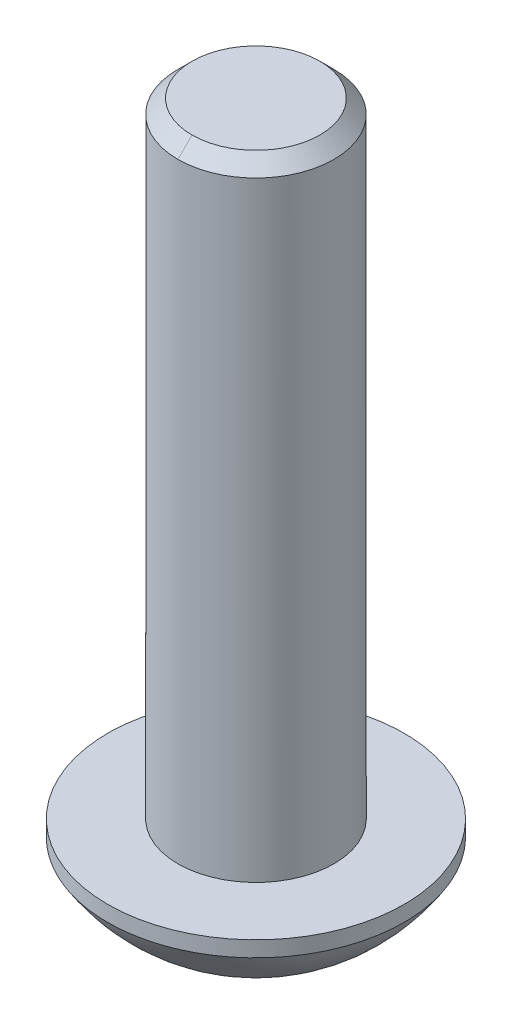
ISO-10303-21;
HEADER;
FILE_DESCRIPTION(('STEP AP214'),'2;1');
FILE_NAME('part.step','',(''),(''),'','','');
FILE_SCHEMA(('AUTOMOTIVE_DESIGN { 1 0 10303 214 1 1 1 1 }'));
ENDSEC;
DATA;
#1=APPLICATION_CONTEXT('core data for automotive mechanical design processes');
#2=APPLICATION_PROTOCOL_DEFINITION('international standard','automotive_design',2000,#1);
#3=PRODUCT_CONTEXT('',#1,'mechanical');
#4=PRODUCT('Part','Part','',(#3));
#5=PRODUCT_RELATED_PRODUCT_CATEGORY('part','',(#4));
#6=PRODUCT_DEFINITION_FORMATION('','',#4);
#7=PRODUCT_DEFINITION_CONTEXT('part definition',#1,'design');
#8=PRODUCT_DEFINITION('design','',#6,#7);
#9=PRODUCT_DEFINITION_SHAPE('','',#8);
#10=(LENGTH_UNIT() NAMED_UNIT(*) SI_UNIT(.MILLI.,.METRE.));
#11=(NAMED_UNIT(*) PLANE_ANGLE_UNIT() SI_UNIT($,.RADIAN.));
#12=(NAMED_UNIT(*) SI_UNIT($,.STERADIAN.) SOLID_ANGLE_UNIT());
#13=UNCERTAINTY_MEASURE_WITH_UNIT(LENGTH_MEASURE(1.E-05),#10,'distance_accuracy_value','');
#14=(GEOMETRIC_REPRESENTATION_CONTEXT(3) GLOBAL_UNCERTAINTY_ASSIGNED_CONTEXT((#13)) GLOBAL_UNIT_ASSIGNED_CONTEXT((#10,
#11,#12)) REPRESENTATION_CONTEXT('',''));
#15=CARTESIAN_POINT('',(0.,0.,0.));
#16=DIRECTION('',(0.,0.,1.));
#17=DIRECTION('',(1.,0.,0.));
#18=AXIS2_PLACEMENT_3D('',#15,#16,#17);
#19=CARTESIAN_POINT('',(-31.8198051533944,59.3856941615627,-26.8198051533952));
#20=DIRECTION('',(0.,-1.,0.));
#21=DIRECTION('',(1.,0.,0.));
#22=AXIS2_PLACEMENT_3D('',#19,#20,#21);
#23=CONICAL_SURFACE('',#22,1.16145793103416,1.0471975508847);
#24=CARTESIAN_POINT('',(-30.6658044417249,59.3899992192963,-26.8198032790632));
#25=CARTESIAN_POINT('',(-30.691149451724,59.404636752233,-26.8637291837364));
#26=CARTESIAN_POINT('',(-30.716713362671,59.4179474913069,-26.9080342238942));
#27=CARTESIAN_POINT('',(-30.768283692372,59.441178019231,-26.997411002029));
#28=CARTESIAN_POINT('',(-30.7942910259156,59.451089592925,-27.0424843249166));
#29=CARTESIAN_POINT('',(-30.8459830892472,59.4665135513052,-27.1320719240015));
#30=CARTESIAN_POINT('',(-30.8716598757556,59.4721287307066,-27.1765724322604));
#31=CARTESIAN_POINT('',(-30.9231338350289,59.4788239813818,-27.2657820755572));
#32=CARTESIAN_POINT('',(-30.9489308214404,59.4799096083444,-27.3104908876438));
#33=CARTESIAN_POINT('',(-30.9971512900105,59.4776115120254,-27.3940618883689));
#34=CARTESIAN_POINT('',(-31.019582001479,59.4747845594776,-27.4329366056309));
#35=CARTESIAN_POINT('',(-31.0642968874339,59.4658345557844,-27.5104320757249));
#36=CARTESIAN_POINT('',(-31.086580906583,59.4597084476974,-27.5490525593403));
#37=CARTESIAN_POINT('',(-31.131387579834,59.444398373724,-27.6267071055563));
#38=CARTESIAN_POINT('',(-31.153904549995,59.4351495456251,-27.6657313173108));
#39=CARTESIAN_POINT('',(-31.1986022933631,59.4141618012945,-27.7431970771213));
#40=CARTESIAN_POINT('',(-31.2207836410025,59.4024278214332,-27.7816396207271));
#41=CARTESIAN_POINT('',(-31.2428057752715,59.3896962755002,-27.8198062311719));
#42=B_SPLINE_CURVE_WITH_KNOTS('',3,(#24,#25,#26,#27,#28,#29,#30,#31,#32,#33,#34,#35,#36,#37,#38,
#39,#40,#41),.UNSPECIFIED.,.F.,.F.,(4,2,2,2,2,2,2,2,4),(0.,0.158413156551532,0.317206514113385,
0.472070294875533,0.626744072684247,0.761528044901939,0.896437121083261,1.03434103155732,
1.17197354407809),.UNSPECIFIED.);
#43=CARTESIAN_POINT('',(-30.6658042504201,59.3899994787229,-26.8198049557177));
#44=VERTEX_POINT('',#43);
#45=CARTESIAN_POINT('',(-31.2428044788645,59.3896961752528,-27.8198056836089));
#46=VERTEX_POINT('',#45);
#47=EDGE_CURVE('E220',#44,#46,#42,.T.);
#48=ORIENTED_EDGE('',*,*,#47,.F.);
#49=CARTESIAN_POINT('',(-31.2428058549799,59.3896962327173,-25.8198038946299));
#50=CARTESIAN_POINT('',(-31.2174521542727,59.4043583285424,-25.8637444779058));
#51=CARTESIAN_POINT('',(-31.1918796082679,59.4176952907797,-25.9080643262664));
#52=CARTESIAN_POINT('',(-31.1402912809489,59.4409804165176,-25.9974721808319));
#53=CARTESIAN_POINT('',(-31.114274580047,59.4509203364324,-26.0425617807416));
#54=CARTESIAN_POINT('',(-31.0625634019704,59.46640069337,-26.1321825378114));
#55=CARTESIAN_POINT('',(-31.0368768984193,59.4720439765283,-26.1766998757712));
#56=CARTESIAN_POINT('',(-30.9853823637518,59.4787934217649,-26.265945170391));
#57=CARTESIAN_POINT('',(-30.9595745210075,59.4799051567499,-26.3106728005841));
#58=CARTESIAN_POINT('',(-30.9113536388275,59.4776525123056,-26.3942445200003));
#59=CARTESIAN_POINT('',(-30.888933453521,59.4748487342738,-26.4331009937136));
#60=CARTESIAN_POINT('',(-30.8442387741125,59.4659462554832,-26.5105614433285));
#61=CARTESIAN_POINT('',(-30.8219644343403,59.4598445026045,-26.5491651517607));
#62=CARTESIAN_POINT('',(-30.7771769245097,59.4445833631352,-26.6267864859461));
#63=CARTESIAN_POINT('',(-30.7546694205909,59.4353591396202,-26.6657942917003));
#64=CARTESIAN_POINT('',(-30.7099900697254,59.4144193585207,-26.7432281753543));
#65=CARTESIAN_POINT('',(-30.6878176505485,59.4027087276364,-26.7816552449875));
#66=CARTESIAN_POINT('',(-30.6658043786145,59.3899995527361,-26.819806496168));
#67=B_SPLINE_CURVE_WITH_KNOTS('',3,(#49,#50,#51,#52,#53,#54,#55,#56,#57,#58,#59,#60,#61,#62,#63,
#64,#65,#66),.UNSPECIFIED.,.F.,.F.,(4,2,2,2,2,2,2,2,4),(0.,0.158482882638774,0.317347668566646,
0.472278609373679,0.627018958225682,0.761735629478716,0.896577188651897,1.03441051969929,
1.1719732475405),.UNSPECIFIED.);
#68=CARTESIAN_POINT('',(-31.242804605313,59.3896961656321,-25.8198045309822));
#69=VERTEX_POINT('',#68);
#70=EDGE_CURVE('E226',#69,#44,#67,.T.);
#71=ORIENTED_EDGE('',*,*,#70,.F.);
#72=CARTESIAN_POINT('',(-31.8198051533944,59.4789119415752,-25.8198051533952));
#73=CARTESIAN_POINT('',(-31.7953136979931,59.4789150583334,-25.8198051533952));
#74=CARTESIAN_POINT('',(-31.7708255625678,59.4783921502977,-25.8198051533952));
#75=CARTESIAN_POINT('',(-31.72189731097,59.4763217056711,-25.8198051533952));
#76=CARTESIAN_POINT('',(-31.69745718627,59.4747743714313,-25.8198051533952));
#77=CARTESIAN_POINT('',(-31.6245082186214,59.4686576453388,-25.8198051533952));
#78=CARTESIAN_POINT('',(-31.5761172803807,59.4626129454803,-25.8198051533952));
#79=CARTESIAN_POINT('',(-31.4799727656233,59.4470681907259,-25.8198051533952));
#80=CARTESIAN_POINT('',(-31.4322185407419,59.4375719820969,-25.8198051533952));
#81=CARTESIAN_POINT('',(-31.3371205700889,59.4156706472131,-25.8198051533952));
#82=CARTESIAN_POINT('',(-31.2897801365193,59.4032510056706,-25.8198051533952));
#83=CARTESIAN_POINT('',(-31.242803355853,59.3896961163618,-25.8198051533952));
#84=B_SPLINE_CURVE_WITH_KNOTS('',3,(#72,#73,#74,#75,#76,#77,#78,#79,#80,#81,#82,#83),
.UNSPECIFIED.,.F.,.F.,(4,2,2,2,2,4),(0.,0.0734625941201163,0.146910681765353,0.293048722693013,
0.439024408207726,0.585740770411544),.UNSPECIFIED.);
#85=CARTESIAN_POINT('',(-31.8198051533944,59.4789119415289,-25.8198051533924));
#86=VERTEX_POINT('',#85);
#87=EDGE_CURVE('E156',#86,#69,#84,.T.);
#88=ORIENTED_EDGE('',*,*,#87,.F.);
#89=DIRECTION('',(0.,0.499999999999999,-0.86602540378444));
#90=VECTOR('',#89,1.);
#91=CARTESIAN_POINT('',(-31.8198051533333,-288022.243641687,498946.360389693));
#92=LINE('',#91,#90);
#93=CARTESIAN_POINT('',(-31.8198051533944,60.0562622107645,-26.8198051531954));
#94=VERTEX_POINT('',#93);
#95=EDGE_CURVE('E251',#86,#94,#92,.T.);
#96=ORIENTED_EDGE('',*,*,#95,.T.);
#97=DIRECTION('',(0.,0.499999999999999,0.86602540378444));
#98=VECTOR('',#97,1.);
#99=CARTESIAN_POINT('',(-31.8198051533944,-288022.243641687,-499000.));
#100=LINE('',#99,#98);
#101=CARTESIAN_POINT('',(-31.8198051533944,59.4789119414912,-27.8198051533972));
#102=VERTEX_POINT('',#101);
#103=EDGE_CURVE('E104',#94,#102,#100,.F.);
#104=ORIENTED_EDGE('',*,*,#103,.T.);
#105=CARTESIAN_POINT('',(-31.2428032107386,59.389696005902,-27.8198050486209));
#106=CARTESIAN_POINT('',(-31.2897799942899,59.4032509429259,-27.8198051159099));
#107=CARTESIAN_POINT('',(-31.3371204372594,59.4156706076019,-27.819805143387));
#108=CARTESIAN_POINT('',(-31.432218431911,59.4375719660062,-27.8198051633528));
#109=CARTESIAN_POINT('',(-31.4799726713511,59.4470681751784,-27.8198051560174));
#110=CARTESIAN_POINT('',(-31.5761172131529,59.4626129349105,-27.81980515077));
#111=CARTESIAN_POINT('',(-31.6245081638656,59.4686576392826,-27.8198051528685));
#112=CARTESIAN_POINT('',(-31.6974571511829,59.4747743692271,-27.8198051536599));
#113=CARTESIAN_POINT('',(-31.7218972827993,59.476321704263,-27.8198051535276));
#114=CARTESIAN_POINT('',(-31.7708255484181,59.4783921499162,-27.8198051532628));
#115=CARTESIAN_POINT('',(-31.7953136909483,59.4789150581758,-27.8198051531304));
#116=CARTESIAN_POINT('',(-31.8198051533944,59.4789119415752,-27.8198051533952));
#117=B_SPLINE_CURVE_WITH_KNOTS('',3,(#105,#106,#107,#108,#109,#110,#111,#112,#113,#114,#115,
#116),.UNSPECIFIED.,.F.,.F.,(4,2,2,2,2,4),(0.,0.146716406914121,0.292692134724955,
0.438830214856948,0.512278323297038,0.585740938667434),.UNSPECIFIED.);
#118=EDGE_CURVE('E117',#46,#102,#117,.T.);
#119=ORIENTED_EDGE('',*,*,#118,.F.);
#120=EDGE_LOOP('',(#48,#71,#88,#96,#104,#119));
#121=FACE_BOUND('',#120,.T.);
#122=ADVANCED_FACE('F17',(#121),#23,.F.);
#123=CARTESIAN_POINT('',(-31.8198051533944,59.3856941615627,-26.8198051533952));
#124=DIRECTION('',(0.,-1.,0.));
#125=DIRECTION('',(1.,0.,0.));
#126=AXIS2_PLACEMENT_3D('',#123,#124,#125);
#127=CONICAL_SURFACE('',#126,1.16145793097557,1.04719755107828);
#128=CARTESIAN_POINT('',(-32.9738060540563,59.3899994146977,-26.8198068275311));
#129=CARTESIAN_POINT('',(-32.9484608928026,59.4046368374997,-26.7758809989174));
#130=CARTESIAN_POINT('',(-32.9228969249226,59.4179475277851,-26.7315759988291));
#131=CARTESIAN_POINT('',(-32.8713265638092,59.4411780140276,-26.6421992679752));
#132=CARTESIAN_POINT('',(-32.8453192559743,59.4510895948529,-26.597125952202));
#133=CARTESIAN_POINT('',(-32.7936272199141,59.4665135558323,-26.5075383737536));
#134=CARTESIAN_POINT('',(-32.7679504354991,59.4721287307787,-26.4630378787652));
#135=CARTESIAN_POINT('',(-32.7164764866102,59.4788239786491,-26.3738282604709));
#136=CARTESIAN_POINT('',(-32.6906795084846,59.4799096073155,-26.3291194601224));
#137=CARTESIAN_POINT('',(-32.6424590448288,59.4776115150825,-26.2455484662708));
#138=CARTESIAN_POINT('',(-32.6200283302202,59.4747845633488,-26.2066737441255));
#139=CARTESIAN_POINT('',(-32.5753134381117,59.4658345605116,-26.1291782637796));
#140=CARTESIAN_POINT('',(-32.5530294159511,59.4597084524343,-26.090557774798));
#141=CARTESIAN_POINT('',(-32.5082227373827,59.4443983778172,-26.012903219246));
#142=CARTESIAN_POINT('',(-32.485705764906,59.4351495491504,-25.9738790035086));
#143=CARTESIAN_POINT('',(-32.4410080172695,59.4141618032804,-25.8964132363612));
#144=CARTESIAN_POINT('',(-32.4188266676734,59.4024278224824,-25.8579706893943));
#145=CARTESIAN_POINT('',(-32.396804531521,59.3896962754668,-25.8198040756251));
#146=B_SPLINE_CURVE_WITH_KNOTS('',3,(#128,#129,#130,#131,#132,#133,#134,#135,#136,#137,#138,
#139,#140,#141,#142,#143,#144,#145),.UNSPECIFIED.,.F.,.F.,(4,2,2,2,2,2,2,2,4),(0.,
0.158413101975472,0.317206409880799,0.47207015063366,0.626743886391308,0.761527875588831,
0.896436970054835,1.03434089437143,1.17197341884806),.UNSPECIFIED.);
#147=CARTESIAN_POINT('',(-32.9738060563636,59.3899994786901,-26.8198052428653));
#148=VERTEX_POINT('',#147);
#149=CARTESIAN_POINT('',(-32.396805827921,59.38969617522,-25.8198046231851));
#150=VERTEX_POINT('',#149);
#151=EDGE_CURVE('E100',#148,#150,#146,.T.);
#152=ORIENTED_EDGE('',*,*,#151,.F.);
#153=CARTESIAN_POINT('',(-32.3968046042347,59.3896963337859,-27.8198063165473));
#154=CARTESIAN_POINT('',(-32.4221582586571,59.4043583912786,-27.7758657054694));
#155=CARTESIAN_POINT('',(-32.4477307833942,59.4176953345779,-27.7315458496549));
#156=CARTESIAN_POINT('',(-32.4993190903349,59.4409804400297,-27.6421379979177));
#157=CARTESIAN_POINT('',(-32.5253357921823,59.4509203586078,-27.5970484083279));
#158=CARTESIAN_POINT('',(-32.5770469664675,59.4664007091793,-27.5074276663338));
#159=CARTESIAN_POINT('',(-32.6027334654397,59.4720439873275,-27.46291033323));
#160=CARTESIAN_POINT('',(-32.6542279922181,59.4787934247546,-27.3736650500455));
#161=CARTESIAN_POINT('',(-32.6800358316499,59.4799051569549,-27.3289374264309));
#162=CARTESIAN_POINT('',(-32.7282567135284,59.4776525079866,-27.2453657080616));
#163=CARTESIAN_POINT('',(-32.7506769018972,59.4748487270884,-27.2065092288626));
#164=CARTESIAN_POINT('',(-32.7953715874627,59.4659462419229,-27.1290487684455));
#165=CARTESIAN_POINT('',(-32.817645930329,59.4598444855242,-27.0904450546979));
#166=CARTESIAN_POINT('',(-32.8624334460695,59.4445833385646,-27.0128237103084));
#167=CARTESIAN_POINT('',(-32.884940952803,59.4353591110957,-26.9738158996661));
#168=CARTESIAN_POINT('',(-32.9296203090817,59.4144193219781,-26.8963820066112));
#169=CARTESIAN_POINT('',(-32.9517927308588,59.4027086870428,-26.8579549324621));
#170=CARTESIAN_POINT('',(-32.9738060053741,59.3899995081289,-26.8198036768271));
#171=B_SPLINE_CURVE_WITH_KNOTS('',3,(#153,#154,#155,#156,#157,#158,#159,#160,#161,#162,#163,
#164,#165,#166,#167,#168,#169,#170),.UNSPECIFIED.,.F.,.F.,(4,2,2,2,2,2,2,2,4),(0.,
0.158482856318898,0.317347617282658,0.472278536709071,0.627018863601674,0.761735554096406,
0.896577132974556,1.03441048297191,1.17197322901768),.UNSPECIFIED.);
#172=CARTESIAN_POINT('',(-32.3968062347606,59.3896960493398,-27.8198057005802));
#173=VERTEX_POINT('',#172);
#174=EDGE_CURVE('E21',#173,#148,#171,.T.);
#175=ORIENTED_EDGE('',*,*,#174,.F.);
#176=CARTESIAN_POINT('',(-31.8198051533944,59.4789119414997,-27.8198051533952));
#177=CARTESIAN_POINT('',(-31.8442966171628,59.4789150582622,-27.8198051533952));
#178=CARTESIAN_POINT('',(-31.8687847609516,59.4783921498671,-27.8198051533952));
#179=CARTESIAN_POINT('',(-31.9177130292247,59.4763217038319,-27.8198051533952));
#180=CARTESIAN_POINT('',(-31.9421531622365,59.4747743685433,-27.8198051533952));
#181=CARTESIAN_POINT('',(-32.015102154498,59.4686576383493,-27.8198051533952));
#182=CARTESIAN_POINT('',(-32.0634931089221,59.4626129344821,-27.8198051533952));
#183=CARTESIAN_POINT('',(-32.1596376554525,59.4470681697707,-27.8198051533952));
#184=CARTESIAN_POINT('',(-32.2073918959247,59.4375719551996,-27.8198051533952));
#185=CARTESIAN_POINT('',(-32.3024898974707,59.4156706070518,-27.8198051533952));
#186=CARTESIAN_POINT('',(-32.3498303463383,59.4032509581738,-27.8198051533952));
#187=CARTESIAN_POINT('',(-32.396807142076,59.3896960611738,-27.8198051533952));
#188=B_SPLINE_CURVE_WITH_KNOTS('',3,(#176,#177,#178,#179,#180,#181,#182,#183,#184,#185,#186,
#187),.UNSPECIFIED.,.F.,.F.,(4,2,2,2,2,4),(0.,0.0734626192092203,0.146910731919221,
0.293048822365536,0.439024557172266,0.585740969270727),.UNSPECIFIED.);
#189=EDGE_CURVE('E97',#102,#173,#188,.T.);
#190=ORIENTED_EDGE('',*,*,#189,.F.);
#191=ORIENTED_EDGE('',*,*,#103,.F.);
#192=ORIENTED_EDGE('',*,*,#95,.F.);
#193=CARTESIAN_POINT('',(-32.3968070960403,59.3896960058726,-25.8198052581644));
#194=CARTESIAN_POINT('',(-32.3498303124883,59.4032509428883,-25.8198051908787));
#195=CARTESIAN_POINT('',(-32.3024898695189,59.4156706075577,-25.8198051634029));
#196=CARTESIAN_POINT('',(-32.2073918748681,59.4375719659509,-25.819805143438));
#197=CARTESIAN_POINT('',(-32.1596376354286,59.4470681751187,-25.8198051507731));
#198=CARTESIAN_POINT('',(-32.0634930936285,59.4626129348433,-25.8198051560202));
#199=CARTESIAN_POINT('',(-32.0151021429169,59.4686576392123,-25.8198051539218));
#200=CARTESIAN_POINT('',(-31.9421531556016,59.4747743691537,-25.8198051531305));
#201=CARTESIAN_POINT('',(-31.9177130239861,59.4763217041888,-25.8198051532628));
#202=CARTESIAN_POINT('',(-31.8687847583689,59.4783921498409,-25.8198051535276));
#203=CARTESIAN_POINT('',(-31.8442966158397,59.4789150581003,-25.81980515366));
#204=CARTESIAN_POINT('',(-31.8198051533944,59.4789119414997,-25.8198051533952));
#205=B_SPLINE_CURVE_WITH_KNOTS('',3,(#193,#194,#195,#196,#197,#198,#199,#200,#201,#202,#203,
#204),.UNSPECIFIED.,.F.,.F.,(4,2,2,2,2,4),(0.,0.146716406909033,0.292692134715531,
0.438830214843196,0.512278323280733,0.585740938648524),.UNSPECIFIED.);
#206=EDGE_CURVE('E149',#150,#86,#205,.T.);
#207=ORIENTED_EDGE('',*,*,#206,.F.);
#208=EDGE_LOOP('',(#152,#175,#190,#191,#192,#207));
#209=FACE_BOUND('',#208,.T.);
#210=ADVANCED_FACE('F94',(#209),#127,.F.);
#211=CARTESIAN_POINT('',(-32.983185324538,60.1416573160268,-26.8035483576523));
#212=DIRECTION('',(0.866156744758905,0.,0.499772441725889));
#213=DIRECTION('',(0.499772441725889,0.,-0.866156744758905));
#214=AXIS2_PLACEMENT_3D('',#211,#212,#213);
#215=PLANE('',#214);
#216=ORIENTED_EDGE('',*,*,#174,.T.);
#217=DIRECTION('',(0.,1.,0.));
#218=VECTOR('',#217,1.);
#219=CARTESIAN_POINT('',(-32.9738051533943,60.1416573160268,-26.8198051533952));
#220=LINE('',#219,#218);
#221=CARTESIAN_POINT('',(-32.9738052620286,58.3500000000004,-26.8198045878865));
#222=VERTEX_POINT('',#221);
#223=EDGE_CURVE('E103',#222,#148,#220,.T.);
#224=ORIENTED_EDGE('',*,*,#223,.F.);
#225=DIRECTION('',(-0.499772441725893,0.,0.866156744758902));
#226=VECTOR('',#225,1.);
#227=CARTESIAN_POINT('',(-32.3968051533943,58.3500000000004,-27.8198051533952));
#228=LINE('',#227,#226);
#229=CARTESIAN_POINT('',(-32.3968079475784,58.3500000000004,-27.8198051533952));
#230=VERTEX_POINT('',#229);
#231=EDGE_CURVE('E109',#230,#222,#228,.T.);
#232=ORIENTED_EDGE('',*,*,#231,.F.);
#233=DIRECTION('',(0.,1.,0.));
#234=VECTOR('',#233,1.);
#235=CARTESIAN_POINT('',(-32.3968079475784,60.1416573160268,-27.8198051533952));
#236=LINE('',#235,#234);
#237=EDGE_CURVE('E106',#173,#230,#236,.F.);
#238=ORIENTED_EDGE('',*,*,#237,.F.);
#239=EDGE_LOOP('',(#216,#224,#232,#238));
#240=FACE_BOUND('',#239,.T.);
#241=ADVANCED_FACE('F107',(#240),#215,.T.);
#242=CARTESIAN_POINT('',(-32.3874249822507,60.1416573160268,-25.8035483576523));
#243=DIRECTION('',(0.866156744758906,0.,-0.499772441725888));
#244=DIRECTION('',(-0.499772441725888,0.,-0.866156744758906));
#245=AXIS2_PLACEMENT_3D('',#242,#243,#244);
#246=PLANE('',#245);
#247=ORIENTED_EDGE('',*,*,#151,.T.);
#248=DIRECTION('',(0.,1.,0.));
#249=VECTOR('',#248,1.);
#250=CARTESIAN_POINT('',(-32.3968051533943,60.1416573160268,-25.8198051533952));
#251=LINE('',#250,#249);
#252=CARTESIAN_POINT('',(-32.396804913593,58.3500000000004,-25.8198051533952));
#253=VERTEX_POINT('',#252);
#254=EDGE_CURVE('E157',#253,#150,#251,.T.);
#255=ORIENTED_EDGE('',*,*,#254,.F.);
#256=DIRECTION('',(0.499772441725893,0.,0.866156744758902));
#257=VECTOR('',#256,1.);
#258=CARTESIAN_POINT('',(-32.9738051533943,58.3500000000004,-26.8198051533952));
#259=LINE('',#258,#257);
#260=EDGE_CURVE('E242',#222,#253,#259,.T.);
#261=ORIENTED_EDGE('',*,*,#260,.F.);
#262=ORIENTED_EDGE('',*,*,#223,.T.);
#263=EDGE_LOOP('',(#247,#255,#261,#262));
#264=FACE_BOUND('',#263,.T.);
#265=ADVANCED_FACE('F167',(#264),#246,.T.);
#266=CARTESIAN_POINT('',(-31.2240362690773,60.1416573160268,-25.8198051533952));
#267=DIRECTION('',(0.,0.,-1.));
#268=DIRECTION('',(-1.,0.,0.));
#269=AXIS2_PLACEMENT_3D('',#266,#267,#268);
#270=PLANE('',#269);
#271=ORIENTED_EDGE('',*,*,#87,.T.);
#272=DIRECTION('',(0.,1.,0.));
#273=VECTOR('',#272,1.);
#274=CARTESIAN_POINT('',(-31.2428051533944,60.1416573160268,-25.8198051533952));
#275=LINE('',#274,#273);
#276=CARTESIAN_POINT('',(-31.2428049789168,58.3500000000004,-25.8198054557827));
#277=VERTEX_POINT('',#276);
#278=EDGE_CURVE('E229',#277,#69,#275,.T.);
#279=ORIENTED_EDGE('',*,*,#278,.F.);
#280=DIRECTION('',(1.,0.,0.));
#281=VECTOR('',#280,1.);
#282=CARTESIAN_POINT('',(-30.5250171533944,58.3500000000004,-25.8198051533952));
#283=LINE('',#282,#281);
#284=EDGE_CURVE('E261',#253,#277,#283,.T.);
#285=ORIENTED_EDGE('',*,*,#284,.F.);
#286=ORIENTED_EDGE('',*,*,#254,.T.);
#287=ORIENTED_EDGE('',*,*,#206,.T.);
#288=EDGE_LOOP('',(#271,#279,#285,#286,#287));
#289=FACE_BOUND('',#288,.T.);
#290=ADVANCED_FACE('F162',(#289),#270,.T.);
#291=CARTESIAN_POINT('',(-30.6564249822508,60.1416573160268,-26.836061949138));
#292=DIRECTION('',(-0.866156744758905,0.,-0.499772441725888));
#293=DIRECTION('',(-0.499772441725888,0.,0.866156744758905));
#294=AXIS2_PLACEMENT_3D('',#291,#292,#293);
#295=PLANE('',#294);
#296=ORIENTED_EDGE('',*,*,#70,.T.);
#297=DIRECTION('',(0.,1.,0.));
#298=VECTOR('',#297,1.);
#299=CARTESIAN_POINT('',(-30.6658051533944,60.1416573160268,-26.8198051533952));
#300=LINE('',#299,#298);
#301=CARTESIAN_POINT('',(-30.6658053166426,58.3500000000004,-26.8198054363211));
#302=VERTEX_POINT('',#301);
#303=EDGE_CURVE('E223',#302,#44,#300,.T.);
#304=ORIENTED_EDGE('',*,*,#303,.F.);
#305=DIRECTION('',(0.499772441725889,0.,-0.866156744758905));
#306=VECTOR('',#305,1.);
#307=CARTESIAN_POINT('',(-31.2428051533944,58.3500000000004,-25.8198051533952));
#308=LINE('',#307,#306);
#309=EDGE_CURVE('E256',#277,#302,#308,.T.);
#310=ORIENTED_EDGE('',*,*,#309,.F.);
#311=ORIENTED_EDGE('',*,*,#278,.T.);
#312=EDGE_LOOP('',(#296,#304,#310,#311));
#313=FACE_BOUND('',#312,.T.);
#314=ADVANCED_FACE('F166',(#313),#295,.T.);
#315=CARTESIAN_POINT('',(-31.252185324538,60.1416573160268,-27.836061949138));
#316=DIRECTION('',(-0.866156744758905,0.,0.499772441725888));
#317=DIRECTION('',(0.499772441725888,0.,0.866156744758905));
#318=AXIS2_PLACEMENT_3D('',#315,#316,#317);
#319=PLANE('',#318);
#320=ORIENTED_EDGE('',*,*,#47,.T.);
#321=DIRECTION('',(0.,1.,0.));
#322=VECTOR('',#321,1.);
#323=CARTESIAN_POINT('',(-31.2428051533944,60.1416573160268,-27.8198051533952));
#324=LINE('',#323,#322);
#325=CARTESIAN_POINT('',(-31.2428053931957,58.3500000000004,-27.8198051533952));
#326=VERTEX_POINT('',#325);
#327=EDGE_CURVE('E119',#326,#46,#324,.T.);
#328=ORIENTED_EDGE('',*,*,#327,.F.);
#329=DIRECTION('',(-0.499772441725889,0.,-0.866156744758905));
#330=VECTOR('',#329,1.);
#331=CARTESIAN_POINT('',(-30.6658051533944,58.3500000000004,-26.8198051533952));
#332=LINE('',#331,#330);
#333=EDGE_CURVE('E247',#302,#326,#332,.T.);
#334=ORIENTED_EDGE('',*,*,#333,.F.);
#335=ORIENTED_EDGE('',*,*,#303,.T.);
#336=EDGE_LOOP('',(#320,#328,#334,#335));
#337=FACE_BOUND('',#336,.T.);
#338=ADVANCED_FACE('F298',(#337),#319,.T.);
#339=CARTESIAN_POINT('',(-32.4155740377114,60.1416573160268,-27.8198051533952));
#340=DIRECTION('',(0.,0.,1.));
#341=DIRECTION('',(1.,0.,0.));
#342=AXIS2_PLACEMENT_3D('',#339,#340,#341);
#343=PLANE('',#342);
#344=ORIENTED_EDGE('',*,*,#189,.T.);
#345=ORIENTED_EDGE('',*,*,#237,.T.);
#346=DIRECTION('',(1.,0.,0.));
#347=VECTOR('',#346,1.);
#348=CARTESIAN_POINT('',(-30.5250171533944,58.3500000000004,-27.8198051533952));
#349=LINE('',#348,#347);
#350=EDGE_CURVE('E245',#326,#230,#349,.F.);
#351=ORIENTED_EDGE('',*,*,#350,.F.);
#352=ORIENTED_EDGE('',*,*,#327,.T.);
#353=ORIENTED_EDGE('',*,*,#118,.T.);
#354=EDGE_LOOP('',(#344,#345,#351,#352,#353));
#355=FACE_BOUND('',#354,.T.);
#356=ADVANCED_FACE('F114',(#355),#343,.T.);
#357=CARTESIAN_POINT('',(-30.5250171533944,58.3500000000004,-25.5250171533951));
#358=DIRECTION('',(0.,-1.,0.));
#359=DIRECTION('',(0.,0.,-1.));
#360=AXIS2_PLACEMENT_3D('',#357,#358,#359);
#361=PLANE('',#360);
#362=CARTESIAN_POINT('',(-31.8198051533944,58.3500000000004,-28.0892051533951));
#363=CARTESIAN_POINT('',(-31.8910548704028,58.3500000000005,-28.0892011192316));
#364=CARTESIAN_POINT('',(-31.9624313917303,58.3500000000005,-28.0831734119653));
#365=CARTESIAN_POINT('',(-32.0679158634375,58.3500000000004,-28.0652372336227));
#366=CARTESIAN_POINT('',(-32.1028586730906,58.3500000000003,-28.0577604306056));
#367=CARTESIAN_POINT('',(-32.17202474939,58.3500000000005,-28.0398843566389));
#368=CARTESIAN_POINT('',(-32.206247407798,58.3500000000008,-28.0294827140882));
#369=CARTESIAN_POINT('',(-32.3072953194064,58.350000000001,-27.9940336179192));
#370=CARTESIAN_POINT('',(-32.3726705893657,58.3500000000004,-27.9647128801906));
#371=CARTESIAN_POINT('',(-32.4975654990553,58.3500000000004,-27.8954977115592));
#372=CARTESIAN_POINT('',(-32.5570849160702,58.3500000000009,-27.8556028787053));
#373=CARTESIAN_POINT('',(-32.6406793536577,58.3500000000007,-27.788732799939));
#374=CARTESIAN_POINT('',(-32.6676124662832,58.3500000000005,-27.7652538120702));
#375=CARTESIAN_POINT('',(-32.7193817852612,58.3500000000003,-27.7161368264052));
#376=CARTESIAN_POINT('',(-32.7442199883105,58.3500000000003,-27.6905009320456));
#377=CARTESIAN_POINT('',(-32.8153748056879,58.3500000000005,-27.610562830517));
#378=CARTESIAN_POINT('',(-32.8583497100299,58.3500000000007,-27.5532157116375));
#379=CARTESIAN_POINT('',(-32.9340363004478,58.3500000000007,-27.4321517088611));
#380=CARTESIAN_POINT('',(-32.9667483735195,58.3500000000005,-27.3684350652687));
#381=CARTESIAN_POINT('',(-33.0210171122539,58.3500000000003,-27.2364071802142));
#382=CARTESIAN_POINT('',(-33.0425738970602,58.3500000000004,-27.1680959878327));
#383=CARTESIAN_POINT('',(-33.0739113518416,58.3500000000004,-27.0288256871735));
#384=CARTESIAN_POINT('',(-33.0836919589269,58.3500000000004,-26.9578665647569));
#385=CARTESIAN_POINT('',(-33.0912022726676,58.3500000000004,-26.8153134265483));
#386=CARTESIAN_POINT('',(-33.088931979323,58.3500000000004,-26.7437194107563));
#387=CARTESIAN_POINT('',(-33.0724021062641,58.3500000000004,-26.6019272529531));
#388=CARTESIAN_POINT('',(-33.0581425905769,58.3500000000004,-26.5317291034894));
#389=CARTESIAN_POINT('',(-33.0180473679798,58.3500000000004,-26.394729718233));
#390=CARTESIAN_POINT('',(-32.9922115374284,58.3500000000004,-26.32792851873));
#391=CARTESIAN_POINT('',(-32.9296649789198,58.3500000000004,-26.1995817978679));
#392=CARTESIAN_POINT('',(-32.8929538408587,58.3500000000004,-26.1380364748188));
#393=CARTESIAN_POINT('',(-32.8305925830388,58.3500000000004,-26.0510641709793));
#394=CARTESIAN_POINT('',(-32.8085856239499,58.3500000000004,-26.0229602715703));
#395=CARTESIAN_POINT('',(-32.7622639588993,58.3500000000004,-25.9686754300841));
#396=CARTESIAN_POINT('',(-32.7379470462717,58.3500000000004,-25.942496369992));
#397=CARTESIAN_POINT('',(-32.6618418846592,58.3500000000004,-25.8672126280171));
#398=CARTESIAN_POINT('',(-32.6068439895718,58.3500000000003,-25.8212845295783));
#399=CARTESIAN_POINT('',(-32.4899134063722,58.3500000000005,-25.7393289516863));
#400=CARTESIAN_POINT('',(-32.4279809819781,58.3500000000008,-25.7033010959096));
#401=CARTESIAN_POINT('',(-32.3312173456799,58.3500000000006,-25.6574304348068));
#402=CARTESIAN_POINT('',(-32.2982771137676,58.3500000000005,-25.6434903617142));
#403=CARTESIAN_POINT('',(-32.2313722980558,58.3500000000003,-25.6184454866755));
#404=CARTESIAN_POINT('',(-32.1974085683282,58.3500000000003,-25.6073383901691));
#405=CARTESIAN_POINT('',(-32.0943927280678,58.3500000000006,-25.5784175167322));
#406=CARTESIAN_POINT('',(-32.0240447137369,58.3500000000012,-25.5649231500775));
#407=CARTESIAN_POINT('',(-31.9310331933401,58.3500000000007,-25.5550900510354));
#408=CARTESIAN_POINT('',(-31.9088269725316,58.3500000000005,-25.553334730778));
#409=CARTESIAN_POINT('',(-31.8643530187719,58.3500000000003,-25.5509916512067));
#410=CARTESIAN_POINT('',(-31.8420852858206,58.3500000000004,-25.5504038918927));
#411=CARTESIAN_POINT('',(-31.748555436386,58.3500000000005,-25.5504091875588));
#412=CARTESIAN_POINT('',(-31.6771789150585,58.3500000000005,-25.5564368948252));
#413=CARTESIAN_POINT('',(-31.5716944433513,58.3500000000004,-25.5743730731677));
#414=CARTESIAN_POINT('',(-31.5367516336982,58.3500000000003,-25.5818498761848));
#415=CARTESIAN_POINT('',(-31.4675855573988,58.3500000000005,-25.5997259501515));
#416=CARTESIAN_POINT('',(-31.4333628989908,58.3500000000008,-25.6101275927022));
#417=CARTESIAN_POINT('',(-31.3323149873824,58.350000000001,-25.6455766888712));
#418=CARTESIAN_POINT('',(-31.2669397174231,58.3500000000004,-25.6748974265998));
#419=CARTESIAN_POINT('',(-31.1420448077335,58.3500000000004,-25.7441125952312));
#420=CARTESIAN_POINT('',(-31.0825253907186,58.3500000000009,-25.7840074280851));
#421=CARTESIAN_POINT('',(-30.9989309531312,58.3500000000007,-25.8508775068514));
#422=CARTESIAN_POINT('',(-30.9719978405056,58.3500000000005,-25.8743564947202));
#423=CARTESIAN_POINT('',(-30.9202285215276,58.3500000000003,-25.9234734803852));
#424=CARTESIAN_POINT('',(-30.8953903184783,58.3500000000003,-25.9491093747448));
#425=CARTESIAN_POINT('',(-30.8242355011009,58.3500000000005,-26.0290474762734));
#426=CARTESIAN_POINT('',(-30.7812605967589,58.3500000000007,-26.0863945951528));
#427=CARTESIAN_POINT('',(-30.705574006341,58.3500000000007,-26.2074585979293));
#428=CARTESIAN_POINT('',(-30.6728619332693,58.3500000000005,-26.2711752415217));
#429=CARTESIAN_POINT('',(-30.6185931945349,58.3500000000003,-26.4032031265763));
#430=CARTESIAN_POINT('',(-30.5970364097286,58.3500000000004,-26.4715143189577));
#431=CARTESIAN_POINT('',(-30.5656989549472,58.3500000000004,-26.6107846196169));
#432=CARTESIAN_POINT('',(-30.5559183478619,58.3500000000004,-26.6817437420335));
#433=CARTESIAN_POINT('',(-30.5484080341212,58.3500000000004,-26.8242968802421));
#434=CARTESIAN_POINT('',(-30.5506783274658,58.3500000000004,-26.8958908960341));
#435=CARTESIAN_POINT('',(-30.5672082005248,58.3500000000004,-27.0376830538373));
#436=CARTESIAN_POINT('',(-30.5814677162119,58.3500000000004,-27.107881203301));
#437=CARTESIAN_POINT('',(-30.621562938809,58.3500000000004,-27.2448805885574));
#438=CARTESIAN_POINT('',(-30.6473987693604,58.3500000000004,-27.3116817880604));
#439=CARTESIAN_POINT('',(-30.709945327869,58.3500000000004,-27.4400285089225));
#440=CARTESIAN_POINT('',(-30.7466564659301,58.3500000000004,-27.5015738319716));
#441=CARTESIAN_POINT('',(-30.80901772375,58.3500000000004,-27.5885461358111));
#442=CARTESIAN_POINT('',(-30.8310246828389,58.3500000000004,-27.6166500352201));
#443=CARTESIAN_POINT('',(-30.8773463478895,58.3500000000004,-27.6709348767064));
#444=CARTESIAN_POINT('',(-30.9016632605171,58.3500000000004,-27.6971139367984));
#445=CARTESIAN_POINT('',(-30.9777684221296,58.3500000000004,-27.7723976787733));
#446=CARTESIAN_POINT('',(-31.032766317217,58.3500000000003,-27.8183257772121));
#447=CARTESIAN_POINT('',(-31.1496969004166,58.3500000000005,-27.9002813551041));
#448=CARTESIAN_POINT('',(-31.2116293248107,58.3500000000008,-27.9363092108808));
#449=CARTESIAN_POINT('',(-31.3083929611089,58.3500000000006,-27.9821798719836));
#450=CARTESIAN_POINT('',(-31.3413331930212,58.3500000000005,-27.9961199450762));
#451=CARTESIAN_POINT('',(-31.408238008733,58.3500000000003,-28.0211648201149));
#452=CARTESIAN_POINT('',(-31.4422017384606,58.3500000000003,-28.0322719166213));
#453=CARTESIAN_POINT('',(-31.545217578721,58.3500000000006,-28.0611927900582));
#454=CARTESIAN_POINT('',(-31.6155655930519,58.3500000000012,-28.074687156713));
#455=CARTESIAN_POINT('',(-31.7085771134487,58.3500000000007,-28.084520255755));
#456=CARTESIAN_POINT('',(-31.7307833342572,58.3500000000005,-28.0862755760124));
#457=CARTESIAN_POINT('',(-31.7752572880169,58.3500000000003,-28.0886186555837));
#458=CARTESIAN_POINT('',(-31.7975250209682,58.3500000000004,-28.0892064148977));
#459=CARTESIAN_POINT('',(-31.8198051533944,58.3500000000004,-28.0892051533951));
#460=B_SPLINE_CURVE_WITH_KNOTS('',3,(#362,#363,#364,#365,#366,#367,#368,#369,#370,#371,#372,
#373,#374,#375,#376,#377,#378,#379,#380,#381,#382,#383,#384,#385,#386,#387,#388,#389,#390,#391,
#392,#393,#394,#395,#396,#397,#398,#399,#400,#401,#402,#403,#404,#405,#406,#407,#408,#409,#410,
#411,#412,#413,#414,#415,#416,#417,#418,#419,#420,#421,#422,#423,#424,#425,#426,#427,#428,#429,
#430,#431,#432,#433,#434,#435,#436,#437,#438,#439,#440,#441,#442,#443,#444,#445,#446,#447,#448,
#449,#450,#451,#452,#453,#454,#455,#456,#457,#458,#459),.UNSPECIFIED.,.T.,.F.,(4,2,2,2,2,2,2,2,
2,2,2,2,2,2,2,2,2,2,2,2,2,2,2,2,2,2,2,2,2,2,2,2,2,2,2,2,2,2,2,2,2,2,2,2,2,2,2,2,4),(0.,
0.213645475550407,0.320749003460457,0.427939627755229,0.641809911302811,0.85568832582482,
0.962767663397934,1.06974376036187,1.28362731776044,1.49750280896442,1.71137601583126,
1.9252503648665,2.1391247139017,2.35299792076828,2.5668734119721,2.78075696937062,
2.88773306633443,2.9948124039075,3.20869081842975,3.42256110197728,3.52975172627223,
3.63685525418256,3.85050072973291,3.91730870718717,3.98411668464145,4.19776216019186,
4.30486568810191,4.41205631239668,4.62592659594425,4.83980501046627,4.94688434803937,
5.05386044500331,5.26774400240189,5.48161949360587,5.69549270047271,5.90936704950795,
6.12324139854316,6.33711460540974,6.55099009661355,6.76487365401207,6.87184975097588,
6.97892908854895,7.1928075030712,7.40667778661873,7.51386841091367,7.620971938824,
7.83461741437436,7.90142539182861,7.96823336928289),.UNSPECIFIED.);
#461=CARTESIAN_POINT('',(-31.8198051533944,58.3500000000004,-28.0892051533951));
#462=VERTEX_POINT('',#461);
#463=EDGE_CURVE('E126',#462,#462,#460,.T.);
#464=ORIENTED_EDGE('',*,*,#463,.F.);
#465=EDGE_LOOP('',(#464));
#466=FACE_BOUND('',#465,.T.);
#467=ORIENTED_EDGE('',*,*,#333,.T.);
#468=ORIENTED_EDGE('',*,*,#350,.T.);
#469=ORIENTED_EDGE('',*,*,#231,.T.);
#470=ORIENTED_EDGE('',*,*,#260,.T.);
#471=ORIENTED_EDGE('',*,*,#284,.T.);
#472=ORIENTED_EDGE('',*,*,#309,.T.);
#473=EDGE_LOOP('',(#467,#468,#469,#470,#471,#472));
#474=FACE_BOUND('',#473,.T.);
#475=ADVANCED_FACE('F209',(#466,#474),#361,.T.);
#476=CARTESIAN_POINT('',(-31.8198051533944,61.4365272740745,-26.8198051533952));
#477=DIRECTION('',(0.,0.,-1.));
#478=DIRECTION('',(-1.,0.,0.));
#479=AXIS2_PLACEMENT_3D('',#476,#477,#478);
#480=SPHERICAL_SURFACE('',#479,3.33736827059933);
#481=ORIENTED_EDGE('',*,*,#463,.T.);
#482=EDGE_LOOP('',(#481));
#483=FACE_BOUND('',#482,.T.);
#484=CARTESIAN_POINT('',(-31.8198051533944,59.7000000000003,-26.8198051533952));
#485=DIRECTION('',(0.,1.,0.));
#486=DIRECTION('',(0.,0.,1.));
#487=AXIS2_PLACEMENT_3D('',#484,#485,#486);
#488=CIRCLE('',#487,2.85);
#489=CARTESIAN_POINT('',(-31.8198051533944,59.7000000000003,-23.9698051533952));
#490=VERTEX_POINT('',#489);
#491=EDGE_CURVE('E286',#490,#490,#488,.T.);
#492=ORIENTED_EDGE('',*,*,#491,.F.);
#493=EDGE_LOOP('',(#492));
#494=FACE_BOUND('',#493,.T.);
#495=ADVANCED_FACE('F204',(#483,#494),#480,.T.);
#496=CARTESIAN_POINT('',(-31.8198051533944,59.7000000000003,-26.8198051533952));
#497=DIRECTION('',(0.,1.,0.));
#498=DIRECTION('',(0.,0.,1.));
#499=AXIS2_PLACEMENT_3D('',#496,#497,#498);
#500=CYLINDRICAL_SURFACE('',#499,2.85);
#501=ORIENTED_EDGE('',*,*,#491,.T.);
#502=EDGE_LOOP('',(#501));
#503=FACE_BOUND('',#502,.T.);
#504=CARTESIAN_POINT('',(-31.8198051533944,60.0000000000005,-26.8198051533952));
#505=DIRECTION('',(0.,1.,0.));
#506=DIRECTION('',(0.,0.,1.));
#507=AXIS2_PLACEMENT_3D('',#504,#505,#506);
#508=CIRCLE('',#507,2.85);
#509=CARTESIAN_POINT('',(-31.8198051533944,60.0000000000005,-23.9698051533952));
#510=VERTEX_POINT('',#509);
#511=EDGE_CURVE('E284',#510,#510,#508,.T.);
#512=ORIENTED_EDGE('',*,*,#511,.F.);
#513=EDGE_LOOP('',(#512));
#514=FACE_BOUND('',#513,.T.);
#515=ADVANCED_FACE('F201',(#503,#514),#500,.T.);
#516=CARTESIAN_POINT('',(-33.3198051533944,72.0000000000005,-25.319805153395));
#517=DIRECTION('',(0.,1.,0.));
#518=DIRECTION('',(0.,0.,1.));
#519=AXIS2_PLACEMENT_3D('',#516,#517,#518);
#520=PLANE('',#519);
#521=CARTESIAN_POINT('',(-31.8198051533944,72.0000000000027,-26.8198051533952));
#522=DIRECTION('',(0.,-1.,0.));
#523=DIRECTION('',(0.,0.,-1.));
#524=AXIS2_PLACEMENT_3D('',#521,#522,#523);
#525=CIRCLE('',#524,1.22939999997217);
#526=CARTESIAN_POINT('',(-31.8198051533944,72.0000000000312,-28.0492051533527));
#527=VERTEX_POINT('',#526);
#528=CARTESIAN_POINT('',(-31.8198051533944,72.0000000000454,-25.5904051533959));
#529=VERTEX_POINT('',#528);
#530=EDGE_CURVE('E281',#527,#529,#525,.T.);
#531=ORIENTED_EDGE('',*,*,#530,.F.);
#532=CARTESIAN_POINT('',(-31.8198051533944,72.0000000000312,-26.8198051533952));
#533=DIRECTION('',(0.,-1.,0.));
#534=DIRECTION('',(0.,0.,-1.));
#535=AXIS2_PLACEMENT_3D('',#532,#533,#534);
#536=CIRCLE('',#535,1.22939999999884);
#537=EDGE_CURVE('E278',#529,#527,#536,.T.);
#538=ORIENTED_EDGE('',*,*,#537,.F.);
#539=EDGE_LOOP('',(#531,#538));
#540=FACE_BOUND('',#539,.T.);
#541=ADVANCED_FACE('F197',(#540),#520,.T.);
#542=CARTESIAN_POINT('',(-34.7268051533944,60.0000000000005,-23.9128051533951));
#543=DIRECTION('',(0.,1.,0.));
#544=DIRECTION('',(0.,0.,1.));
#545=AXIS2_PLACEMENT_3D('',#542,#543,#544);
#546=PLANE('',#545);
#547=ORIENTED_EDGE('',*,*,#511,.T.);
#548=EDGE_LOOP('',(#547));
#549=FACE_BOUND('',#548,.T.);
#550=CARTESIAN_POINT('',(-31.8198051533944,60.0000000000005,-26.8198051533952));
#551=DIRECTION('',(0.,1.,0.));
#552=DIRECTION('',(0.,0.,1.));
#553=AXIS2_PLACEMENT_3D('',#550,#551,#552);
#554=CIRCLE('',#553,1.5);
#555=CARTESIAN_POINT('',(-31.8198051533944,60.0000000000005,-25.3198051533952));
#556=VERTEX_POINT('',#555);
#557=EDGE_CURVE('E275',#556,#556,#554,.T.);
#558=ORIENTED_EDGE('',*,*,#557,.F.);
#559=EDGE_LOOP('',(#558));
#560=FACE_BOUND('',#559,.T.);
#561=ADVANCED_FACE('F194',(#549,#560),#546,.T.);
#562=CARTESIAN_POINT('',(-31.8198051533944,71.7294000000948,-26.8198051533952));
#563=DIRECTION('',(0.,-1.,0.));
#564=DIRECTION('',(0.,0.,-1.));
#565=AXIS2_PLACEMENT_3D('',#562,#563,#564);
#566=CONICAL_SURFACE('',#565,1.49999999988014,0.785398163397448);
#567=CARTESIAN_POINT('',(-31.8198051533944,71.7294000000004,-26.8198051533952));
#568=DIRECTION('',(0.,-1.,0.));
#569=DIRECTION('',(0.,0.,-1.));
#570=AXIS2_PLACEMENT_3D('',#567,#568,#569);
#571=CIRCLE('',#570,1.5);
#572=CARTESIAN_POINT('',(-31.8198051533944,71.7294000000143,-28.3198051533544));
#573=VERTEX_POINT('',#572);
#574=CARTESIAN_POINT('',(-31.8198051533944,71.7294000000143,-25.3198051533934));
#575=VERTEX_POINT('',#574);
#576=EDGE_CURVE('E31',#573,#575,#571,.T.);
#577=ORIENTED_EDGE('',*,*,#576,.F.);
#578=DIRECTION('',(0.,0.70710678118655,0.707106781186546));
#579=VECTOR('',#578,1.);
#580=CARTESIAN_POINT('',(-31.8198051533944,-498899.950794849,-499000.));
#581=LINE('',#580,#579);
#582=EDGE_CURVE('E214',#527,#573,#581,.F.);
#583=ORIENTED_EDGE('',*,*,#582,.F.);
#584=ORIENTED_EDGE('',*,*,#530,.T.);
#585=DIRECTION('',(0.,0.70710678118655,-0.707106781186546));
#586=VECTOR('',#585,1.);
#587=CARTESIAN_POINT('',(-31.8198051533333,-498899.950794849,498946.360389693));
#588=LINE('',#587,#586);
#589=EDGE_CURVE('E277',#575,#529,#588,.T.);
#590=ORIENTED_EDGE('',*,*,#589,.F.);
#591=EDGE_LOOP('',(#577,#583,#584,#590));
#592=FACE_BOUND('',#591,.T.);
#593=ADVANCED_FACE('F186',(#592),#566,.T.);
#594=CARTESIAN_POINT('',(-31.8198051533944,71.7294000000379,-26.8198051533952));
#595=DIRECTION('',(0.,-1.,0.));
#596=DIRECTION('',(0.,0.,-1.));
#597=AXIS2_PLACEMENT_3D('',#594,#595,#596);
#598=CONICAL_SURFACE('',#597,1.49999999993523,0.785398163292416);
#599=CARTESIAN_POINT('',(-31.8198051533944,71.7294000000004,-26.8198051533952));
#600=DIRECTION('',(0.,-1.,0.));
#601=DIRECTION('',(0.,0.,-1.));
#602=AXIS2_PLACEMENT_3D('',#599,#600,#601);
#603=CIRCLE('',#602,1.5);
#604=EDGE_CURVE('E11',#575,#573,#603,.T.);
#605=ORIENTED_EDGE('',*,*,#604,.F.);
#606=ORIENTED_EDGE('',*,*,#589,.T.);
#607=ORIENTED_EDGE('',*,*,#537,.T.);
#608=ORIENTED_EDGE('',*,*,#582,.T.);
#609=EDGE_LOOP('',(#605,#606,#607,#608));
#610=FACE_BOUND('',#609,.T.);
#611=ADVANCED_FACE('F180',(#610),#598,.T.);
#612=CARTESIAN_POINT('',(-31.8198051533944,60.5000000000005,-26.8198051533952));
#613=DIRECTION('',(0.,-1.,0.));
#614=DIRECTION('',(0.,0.,-1.));
#615=AXIS2_PLACEMENT_3D('',#612,#613,#614);
#616=CYLINDRICAL_SURFACE('',#615,1.5);
#617=ORIENTED_EDGE('',*,*,#557,.T.);
#618=EDGE_LOOP('',(#617));
#619=FACE_BOUND('',#618,.T.);
#620=ORIENTED_EDGE('',*,*,#604,.T.);
#621=ORIENTED_EDGE('',*,*,#576,.T.);
#622=EDGE_LOOP('',(#620,#621));
#623=FACE_BOUND('',#622,.T.);
#624=ADVANCED_FACE('F178',(#619,#623),#616,.T.);
#625=CLOSED_SHELL('',(#122,#210,#241,#265,#290,#314,#338,#356,#475,#495,#515,#541,#561,#593,
#611,#624));
#626=MANIFOLD_SOLID_BREP('B1',#625);
#627=ADVANCED_BREP_SHAPE_REPRESENTATION('',(#18,#626),#14);
#628=SHAPE_DEFINITION_REPRESENTATION(#9,#627);
ENDSEC;
END-ISO-10303-21;
